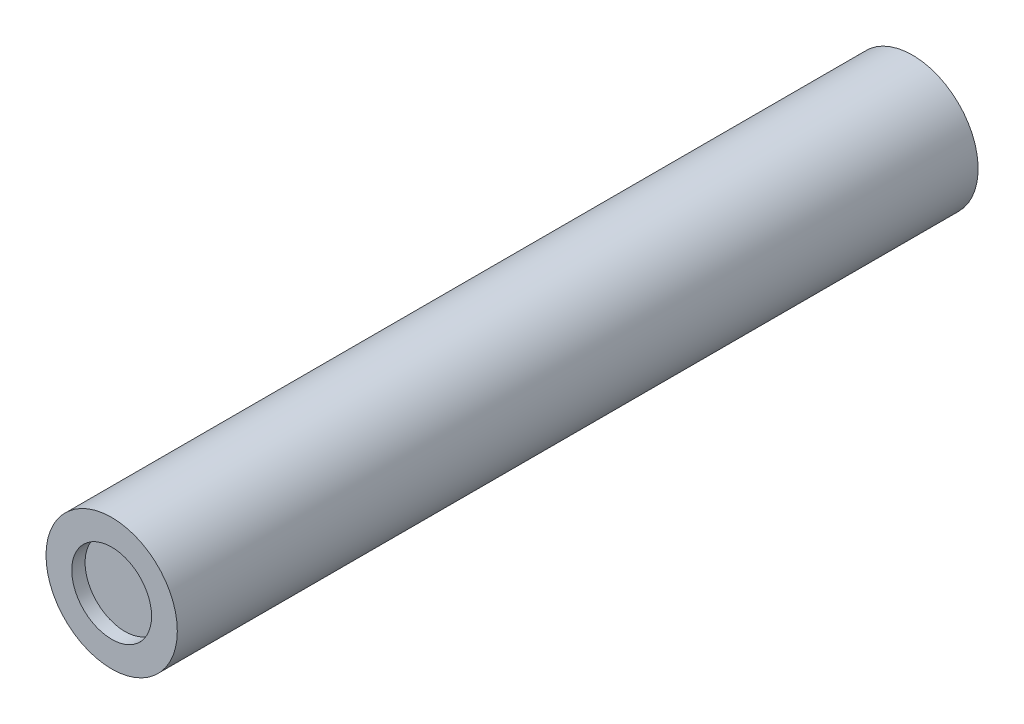
ISO-10303-21;
HEADER;
FILE_DESCRIPTION(('STEP AP214'),'2;1');
FILE_NAME('part.step','',(''),(''),'','','');
FILE_SCHEMA(('AUTOMOTIVE_DESIGN { 1 0 10303 214 1 1 1 1 }'));
ENDSEC;
DATA;
#1=APPLICATION_CONTEXT('core data for automotive mechanical design processes');
#2=APPLICATION_PROTOCOL_DEFINITION('international standard','automotive_design',2000,#1);
#3=PRODUCT_CONTEXT('',#1,'mechanical');
#4=PRODUCT('Part','Part','',(#3));
#5=PRODUCT_RELATED_PRODUCT_CATEGORY('part','',(#4));
#6=PRODUCT_DEFINITION_FORMATION('','',#4);
#7=PRODUCT_DEFINITION_CONTEXT('part definition',#1,'design');
#8=PRODUCT_DEFINITION('design','',#6,#7);
#9=PRODUCT_DEFINITION_SHAPE('','',#8);
#10=(LENGTH_UNIT() NAMED_UNIT(*) SI_UNIT(.MILLI.,.METRE.));
#11=(NAMED_UNIT(*) PLANE_ANGLE_UNIT() SI_UNIT($,.RADIAN.));
#12=(NAMED_UNIT(*) SI_UNIT($,.STERADIAN.) SOLID_ANGLE_UNIT());
#13=UNCERTAINTY_MEASURE_WITH_UNIT(LENGTH_MEASURE(1.E-05),#10,'distance_accuracy_value','');
#14=(GEOMETRIC_REPRESENTATION_CONTEXT(3) GLOBAL_UNCERTAINTY_ASSIGNED_CONTEXT((#13)) GLOBAL_UNIT_ASSIGNED_CONTEXT((#10,
#11,#12)) REPRESENTATION_CONTEXT('',''));
#15=CARTESIAN_POINT('',(0.,0.,0.));
#16=DIRECTION('',(0.,0.,1.));
#17=DIRECTION('',(1.,0.,0.));
#18=AXIS2_PLACEMENT_3D('',#15,#16,#17);
#19=CARTESIAN_POINT('',(0.,0.,155.));
#20=DIRECTION('',(0.,0.,-1.));
#21=DIRECTION('',(-1.,0.,0.));
#22=AXIS2_PLACEMENT_3D('',#19,#20,#21);
#23=CYLINDRICAL_SURFACE('',#22,12.5);
#24=CARTESIAN_POINT('',(0.,0.,155.));
#25=DIRECTION('',(0.,0.,1.));
#26=DIRECTION('',(1.,0.,0.));
#27=AXIS2_PLACEMENT_3D('',#24,#25,#26);
#28=CIRCLE('',#27,12.5);
#29=CARTESIAN_POINT('',(12.5,0.,155.));
#30=VERTEX_POINT('',#29);
#31=EDGE_CURVE('E10',#30,#30,#28,.T.);
#32=ORIENTED_EDGE('',*,*,#31,.F.);
#33=EDGE_LOOP('',(#32));
#34=FACE_BOUND('',#33,.T.);
#35=CARTESIAN_POINT('',(0.,0.,2.53999999999999));
#36=DIRECTION('',(0.,0.,-1.));
#37=DIRECTION('',(-1.,0.,0.));
#38=AXIS2_PLACEMENT_3D('',#35,#36,#37);
#39=CIRCLE('',#38,12.5);
#40=CARTESIAN_POINT('',(-12.5,0.,2.53999999999999));
#41=VERTEX_POINT('',#40);
#42=EDGE_CURVE('E40',#41,#41,#39,.T.);
#43=ORIENTED_EDGE('',*,*,#42,.F.);
#44=EDGE_LOOP('',(#43));
#45=FACE_BOUND('',#44,.T.);
#46=ADVANCED_FACE('F37',(#34,#45),#23,.T.);
#47=CARTESIAN_POINT('',(0.,0.,155.));
#48=DIRECTION('',(0.,0.,1.));
#49=DIRECTION('',(1.,0.,0.));
#50=AXIS2_PLACEMENT_3D('',#47,#48,#49);
#51=PLANE('',#50);
#52=CARTESIAN_POINT('',(0.,0.,155.));
#53=DIRECTION('',(0.,0.,1.));
#54=DIRECTION('',(1.,0.,0.));
#55=AXIS2_PLACEMENT_3D('',#52,#53,#54);
#56=CIRCLE('',#55,7.60002761853928);
#57=CARTESIAN_POINT('',(7.60002761853928,0.,155.));
#58=VERTEX_POINT('',#57);
#59=EDGE_CURVE('E51',#58,#58,#56,.T.);
#60=ORIENTED_EDGE('',*,*,#59,.F.);
#61=EDGE_LOOP('',(#60));
#62=FACE_BOUND('',#61,.T.);
#63=ORIENTED_EDGE('',*,*,#31,.T.);
#64=EDGE_LOOP('',(#63));
#65=FACE_BOUND('',#64,.T.);
#66=ADVANCED_FACE('F68',(#62,#65),#51,.T.);
#67=CARTESIAN_POINT('',(0.,0.,2.54));
#68=DIRECTION('',(0.,0.,-1.));
#69=DIRECTION('',(-1.,0.,0.));
#70=AXIS2_PLACEMENT_3D('',#67,#68,#69);
#71=PLANE('',#70);
#72=ORIENTED_EDGE('',*,*,#42,.T.);
#73=EDGE_LOOP('',(#72));
#74=FACE_BOUND('',#73,.T.);
#75=ADVANCED_FACE('F64',(#74),#71,.T.);
#76=CARTESIAN_POINT('',(0.,0.,152.46));
#77=DIRECTION('',(0.,0.,1.));
#78=DIRECTION('',(1.,0.,0.));
#79=AXIS2_PLACEMENT_3D('',#76,#77,#78);
#80=CYLINDRICAL_SURFACE('',#79,7.60002761853928);
#81=CARTESIAN_POINT('',(0.,0.,152.46));
#82=DIRECTION('',(0.,0.,1.));
#83=DIRECTION('',(1.,0.,0.));
#84=AXIS2_PLACEMENT_3D('',#81,#82,#83);
#85=CIRCLE('',#84,7.60002761853928);
#86=CARTESIAN_POINT('',(7.60002761853928,0.,152.46));
#87=VERTEX_POINT('',#86);
#88=EDGE_CURVE('E49',#87,#87,#85,.T.);
#89=ORIENTED_EDGE('',*,*,#88,.F.);
#90=EDGE_LOOP('',(#89));
#91=FACE_BOUND('',#90,.T.);
#92=ORIENTED_EDGE('',*,*,#59,.T.);
#93=EDGE_LOOP('',(#92));
#94=FACE_BOUND('',#93,.T.);
#95=ADVANCED_FACE('F61',(#91,#94),#80,.F.);
#96=CARTESIAN_POINT('',(0.,0.,152.46));
#97=DIRECTION('',(0.,0.,1.));
#98=DIRECTION('',(1.,0.,0.));
#99=AXIS2_PLACEMENT_3D('',#96,#97,#98);
#100=PLANE('',#99);
#101=ORIENTED_EDGE('',*,*,#88,.T.);
#102=EDGE_LOOP('',(#101));
#103=FACE_BOUND('',#102,.T.);
#104=ADVANCED_FACE('F59',(#103),#100,.T.);
#105=CLOSED_SHELL('',(#46,#66,#75,#95,#104));
#106=MANIFOLD_SOLID_BREP('B2',#105);
#107=ADVANCED_BREP_SHAPE_REPRESENTATION('',(#18,#106),#14);
#108=SHAPE_DEFINITION_REPRESENTATION(#9,#107);
ENDSEC;
END-ISO-10303-21;
